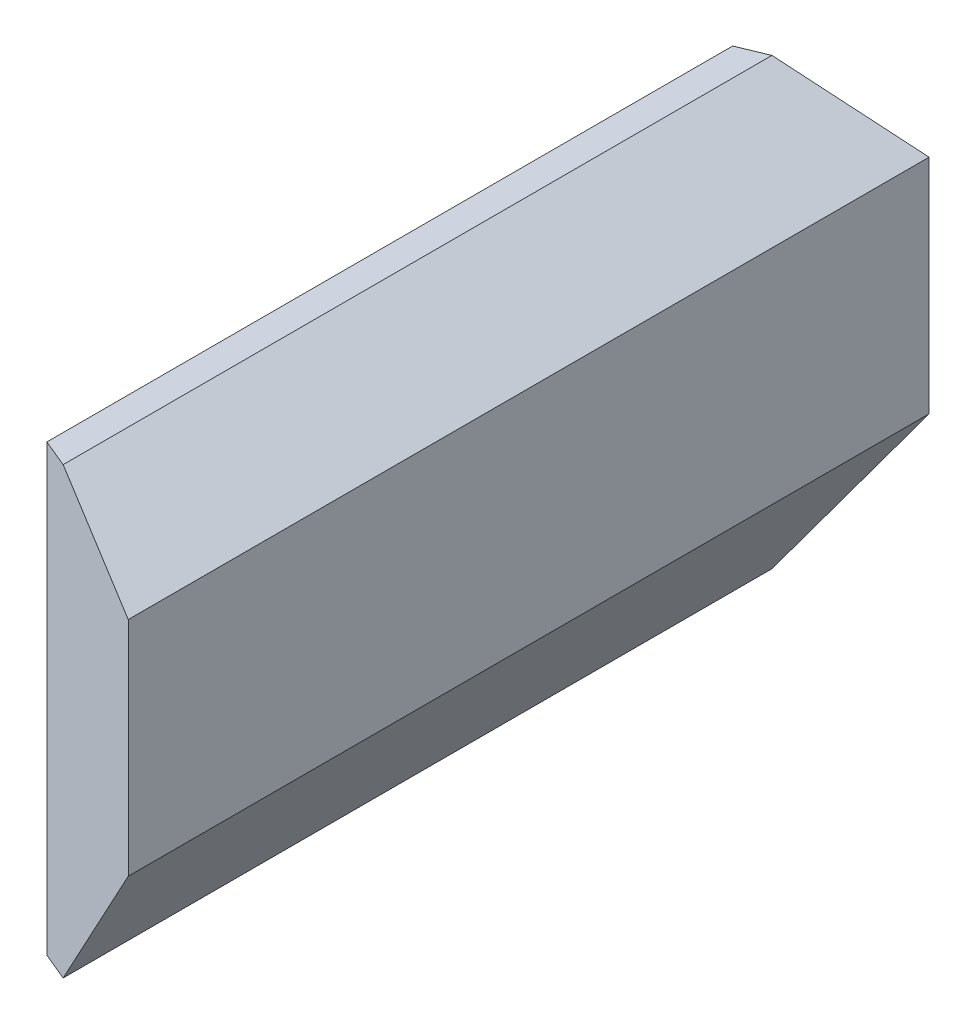
ISO-10303-21;
HEADER;
FILE_DESCRIPTION(('STEP AP214'),'2;1');
FILE_NAME('part.step','',(''),(''),'','','');
FILE_SCHEMA(('AUTOMOTIVE_DESIGN { 1 0 10303 214 1 1 1 1 }'));
ENDSEC;
DATA;
#1=APPLICATION_CONTEXT('core data for automotive mechanical design processes');
#2=APPLICATION_PROTOCOL_DEFINITION('international standard','automotive_design',2000,#1);
#3=PRODUCT_CONTEXT('',#1,'mechanical');
#4=PRODUCT('Part','Part','',(#3));
#5=PRODUCT_RELATED_PRODUCT_CATEGORY('part','',(#4));
#6=PRODUCT_DEFINITION_FORMATION('','',#4);
#7=PRODUCT_DEFINITION_CONTEXT('part definition',#1,'design');
#8=PRODUCT_DEFINITION('design','',#6,#7);
#9=PRODUCT_DEFINITION_SHAPE('','',#8);
#10=(LENGTH_UNIT() NAMED_UNIT(*) SI_UNIT(.MILLI.,.METRE.));
#11=(NAMED_UNIT(*) PLANE_ANGLE_UNIT() SI_UNIT($,.RADIAN.));
#12=(NAMED_UNIT(*) SI_UNIT($,.STERADIAN.) SOLID_ANGLE_UNIT());
#13=UNCERTAINTY_MEASURE_WITH_UNIT(LENGTH_MEASURE(1.E-05),#10,'distance_accuracy_value','');
#14=(GEOMETRIC_REPRESENTATION_CONTEXT(3) GLOBAL_UNCERTAINTY_ASSIGNED_CONTEXT((#13)) GLOBAL_UNIT_ASSIGNED_CONTEXT((#10,
#11,#12)) REPRESENTATION_CONTEXT('',''));
#15=CARTESIAN_POINT('',(0.,0.,0.));
#16=DIRECTION('',(0.,0.,1.));
#17=DIRECTION('',(1.,0.,0.));
#18=AXIS2_PLACEMENT_3D('',#15,#16,#17);
#19=CARTESIAN_POINT('',(0.,0.,150.));
#20=DIRECTION('',(1.,0.,0.));
#21=DIRECTION('',(0.,0.,-1.));
#22=AXIS2_PLACEMENT_3D('',#19,#20,#21);
#23=PLANE('',#22);
#24=DIRECTION('',(0.,0.,1.));
#25=VECTOR('',#24,1.);
#26=CARTESIAN_POINT('',(1.85048618138797E-13,-25.,78.7));
#27=LINE('',#26,#25);
#28=CARTESIAN_POINT('',(1.85048618138797E-13,-25.,78.7));
#29=VERTEX_POINT('',#28);
#30=CARTESIAN_POINT('',(0.,-25.,131.7));
#31=VERTEX_POINT('',#30);
#32=EDGE_CURVE('E59',#29,#31,#27,.T.);
#33=ORIENTED_EDGE('',*,*,#32,.F.);
#34=DIRECTION('',(0.,1.,0.));
#35=VECTOR('',#34,1.);
#36=CARTESIAN_POINT('',(1.85048618138797E-13,-25.,78.7));
#37=LINE('',#36,#35);
#38=CARTESIAN_POINT('',(-2.10885595011007E-13,45.,78.7));
#39=VERTEX_POINT('',#38);
#40=EDGE_CURVE('E214',#29,#39,#37,.T.);
#41=ORIENTED_EDGE('',*,*,#40,.T.);
#42=DIRECTION('',(0.,0.,1.));
#43=VECTOR('',#42,1.);
#44=CARTESIAN_POINT('',(-2.10885595011007E-13,45.,78.7));
#45=LINE('',#44,#43);
#46=CARTESIAN_POINT('',(-3.95934213149804E-13,45.0000000000001,131.7));
#47=VERTEX_POINT('',#46);
#48=EDGE_CURVE('E196',#39,#47,#45,.T.);
#49=ORIENTED_EDGE('',*,*,#48,.T.);
#50=DIRECTION('',(0.,1.,0.));
#51=VECTOR('',#50,1.);
#52=CARTESIAN_POINT('',(0.,-25.,131.7));
#53=LINE('',#52,#51);
#54=EDGE_CURVE('E204',#31,#47,#53,.T.);
#55=ORIENTED_EDGE('',*,*,#54,.F.);
#56=EDGE_LOOP('',(#33,#41,#49,#55));
#57=FACE_BOUND('',#56,.T.);
#58=DIRECTION('',(0.,0.,-1.));
#59=VECTOR('',#58,1.);
#60=CARTESIAN_POINT('',(0.,-30.,150.));
#61=LINE('',#60,#59);
#62=CARTESIAN_POINT('',(0.,-30.,136.7));
#63=VERTEX_POINT('',#62);
#64=CARTESIAN_POINT('',(0.,-30.,13.3));
#65=VERTEX_POINT('',#64);
#66=EDGE_CURVE('E11',#63,#65,#61,.T.);
#67=ORIENTED_EDGE('',*,*,#66,.F.);
#68=DIRECTION('',(0.,1.,0.));
#69=VECTOR('',#68,1.);
#70=CARTESIAN_POINT('',(0.,-30.001,136.7));
#71=LINE('',#70,#69);
#72=CARTESIAN_POINT('',(0.,50.,136.7));
#73=VERTEX_POINT('',#72);
#74=EDGE_CURVE('E289',#63,#73,#71,.T.);
#75=ORIENTED_EDGE('',*,*,#74,.T.);
#76=DIRECTION('',(0.,0.,-1.));
#77=VECTOR('',#76,1.);
#78=CARTESIAN_POINT('',(0.,50.,150.));
#79=LINE('',#78,#77);
#80=CARTESIAN_POINT('',(0.,50.,13.3));
#81=VERTEX_POINT('',#80);
#82=EDGE_CURVE('E323',#73,#81,#79,.T.);
#83=ORIENTED_EDGE('',*,*,#82,.T.);
#84=DIRECTION('',(0.,1.,0.));
#85=VECTOR('',#84,1.);
#86=CARTESIAN_POINT('',(0.,-30.001,13.3));
#87=LINE('',#86,#85);
#88=EDGE_CURVE('E308',#65,#81,#87,.T.);
#89=ORIENTED_EDGE('',*,*,#88,.F.);
#90=EDGE_LOOP('',(#67,#75,#83,#89));
#91=FACE_BOUND('',#90,.T.);
#92=DIRECTION('',(0.,1.,0.));
#93=VECTOR('',#92,1.);
#94=CARTESIAN_POINT('',(2.10885595011007E-13,-25.,71.3));
#95=LINE('',#94,#93);
#96=CARTESIAN_POINT('',(2.10885595011007E-13,-25.,71.3));
#97=VERTEX_POINT('',#96);
#98=CARTESIAN_POINT('',(2.10885595011007E-13,45.,71.3));
#99=VERTEX_POINT('',#98);
#100=EDGE_CURVE('E240',#97,#99,#95,.T.);
#101=ORIENTED_EDGE('',*,*,#100,.F.);
#102=DIRECTION('',(0.,0.,-1.));
#103=VECTOR('',#102,1.);
#104=CARTESIAN_POINT('',(2.10885595011007E-13,-25.,71.3));
#105=LINE('',#104,#103);
#106=CARTESIAN_POINT('',(3.95934213149804E-13,-25.,18.3));
#107=VERTEX_POINT('',#106);
#108=EDGE_CURVE('E265',#97,#107,#105,.T.);
#109=ORIENTED_EDGE('',*,*,#108,.T.);
#110=DIRECTION('',(0.,1.,0.));
#111=VECTOR('',#110,1.);
#112=CARTESIAN_POINT('',(3.95934213149804E-13,-25.,18.3));
#113=LINE('',#112,#111);
#114=CARTESIAN_POINT('',(0.,45.,18.3));
#115=VERTEX_POINT('',#114);
#116=EDGE_CURVE('E216',#107,#115,#113,.T.);
#117=ORIENTED_EDGE('',*,*,#116,.T.);
#118=DIRECTION('',(0.,0.,-1.));
#119=VECTOR('',#118,1.);
#120=CARTESIAN_POINT('',(2.10885595011007E-13,45.,71.3));
#121=LINE('',#120,#119);
#122=EDGE_CURVE('E264',#99,#115,#121,.T.);
#123=ORIENTED_EDGE('',*,*,#122,.F.);
#124=EDGE_LOOP('',(#101,#109,#117,#123));
#125=FACE_BOUND('',#124,.T.);
#126=ADVANCED_FACE('F40',(#57,#91,#125),#23,.F.);
#127=CARTESIAN_POINT('',(5.,-30.,150.));
#128=DIRECTION('',(0.,1.,0.));
#129=DIRECTION('',(0.,0.,1.));
#130=AXIS2_PLACEMENT_3D('',#127,#128,#129);
#131=PLANE('',#130);
#132=DIRECTION('',(0.,0.,-1.));
#133=VECTOR('',#132,1.);
#134=CARTESIAN_POINT('',(5.,-30.,150.));
#135=LINE('',#134,#133);
#136=CARTESIAN_POINT('',(4.99999999999999,-30.,138.771067811865));
#137=VERTEX_POINT('',#136);
#138=CARTESIAN_POINT('',(5.,-30.,11.2289321881345));
#139=VERTEX_POINT('',#138);
#140=EDGE_CURVE('E49',#137,#139,#135,.T.);
#141=ORIENTED_EDGE('',*,*,#140,.F.);
#142=DIRECTION('',(0.923879532511285,0.,0.382683432365094));
#143=VECTOR('',#142,1.);
#144=CARTESIAN_POINT('',(0.,-30.,136.7));
#145=LINE('',#144,#143);
#146=EDGE_CURVE('E299',#63,#137,#145,.T.);
#147=ORIENTED_EDGE('',*,*,#146,.F.);
#148=ORIENTED_EDGE('',*,*,#66,.T.);
#149=DIRECTION('',(-0.923879532511285,0.,0.382683432365094));
#150=VECTOR('',#149,1.);
#151=CARTESIAN_POINT('',(0.,-30.,13.3));
#152=LINE('',#151,#150);
#153=EDGE_CURVE('E320',#139,#65,#152,.T.);
#154=ORIENTED_EDGE('',*,*,#153,.F.);
#155=EDGE_LOOP('',(#141,#147,#148,#154));
#156=FACE_BOUND('',#155,.T.);
#157=ADVANCED_FACE('F42',(#156),#131,.F.);
#158=CARTESIAN_POINT('',(25.,0.,150.));
#159=DIRECTION('',(-0.832050294337844,0.554700196225229,0.));
#160=DIRECTION('',(-0.554700196225229,-0.832050294337844,0.));
#161=AXIS2_PLACEMENT_3D('',#158,#159,#160);
#162=PLANE('',#161);
#163=DIRECTION('',(0.,0.,-1.));
#164=VECTOR('',#163,1.);
#165=CARTESIAN_POINT('',(25.,0.,150.));
#166=LINE('',#165,#164);
#167=CARTESIAN_POINT('',(25.,0.,147.055339059328));
#168=VERTEX_POINT('',#167);
#169=CARTESIAN_POINT('',(25.,0.,2.94466094067248));
#170=VERTEX_POINT('',#169);
#171=EDGE_CURVE('E331',#168,#170,#166,.T.);
#172=ORIENTED_EDGE('',*,*,#171,.F.);
#173=DIRECTION('',(0.540613769225996,0.810920653838993,0.223929555219049));
#174=VECTOR('',#173,1.);
#175=CARTESIAN_POINT('',(3.28752313924208,-32.5687152911369,138.061736670889));
#176=LINE('',#175,#174);
#177=EDGE_CURVE('E296',#137,#168,#176,.T.);
#178=ORIENTED_EDGE('',*,*,#177,.F.);
#179=ORIENTED_EDGE('',*,*,#140,.T.);
#180=DIRECTION('',(-0.540613769225996,-0.810920653838993,0.223929555219049));
#181=VECTOR('',#180,1.);
#182=CARTESIAN_POINT('',(3.28752313924208,-32.5687152911369,11.9382633291105));
#183=LINE('',#182,#181);
#184=EDGE_CURVE('E316',#170,#139,#183,.T.);
#185=ORIENTED_EDGE('',*,*,#184,.F.);
#186=EDGE_LOOP('',(#172,#178,#179,#185));
#187=FACE_BOUND('',#186,.T.);
#188=ADVANCED_FACE('F339',(#187),#162,.F.);
#189=CARTESIAN_POINT('',(25.,0.,150.));
#190=DIRECTION('',(-1.,0.,0.));
#191=DIRECTION('',(0.,-1.,0.));
#192=AXIS2_PLACEMENT_3D('',#189,#190,#191);
#193=PLANE('',#192);
#194=DIRECTION('',(0.,0.,-1.));
#195=VECTOR('',#194,1.);
#196=CARTESIAN_POINT('',(25.,40.,150.));
#197=LINE('',#196,#195);
#198=CARTESIAN_POINT('',(25.,40.,147.055339059328));
#199=VERTEX_POINT('',#198);
#200=CARTESIAN_POINT('',(25.,40.,2.94466094067248));
#201=VERTEX_POINT('',#200);
#202=EDGE_CURVE('E329',#199,#201,#197,.T.);
#203=ORIENTED_EDGE('',*,*,#202,.F.);
#204=DIRECTION('',(0.,1.,0.));
#205=VECTOR('',#204,1.);
#206=CARTESIAN_POINT('',(25.,-30.001,147.055339059328));
#207=LINE('',#206,#205);
#208=EDGE_CURVE('E293',#168,#199,#207,.T.);
#209=ORIENTED_EDGE('',*,*,#208,.F.);
#210=ORIENTED_EDGE('',*,*,#171,.T.);
#211=DIRECTION('',(0.,-1.,0.));
#212=VECTOR('',#211,1.);
#213=CARTESIAN_POINT('',(25.,-30.001,2.94466094067248));
#214=LINE('',#213,#212);
#215=EDGE_CURVE('E312',#201,#170,#214,.T.);
#216=ORIENTED_EDGE('',*,*,#215,.F.);
#217=EDGE_LOOP('',(#203,#209,#210,#216));
#218=FACE_BOUND('',#217,.T.);
#219=ADVANCED_FACE('F361',(#218),#193,.F.);
#220=CARTESIAN_POINT('',(5.,50.,150.));
#221=DIRECTION('',(-0.447213595499958,-0.894427190999916,0.));
#222=DIRECTION('',(0.894427190999916,-0.447213595499958,0.));
#223=AXIS2_PLACEMENT_3D('',#220,#221,#222);
#224=PLANE('',#223);
#225=DIRECTION('',(0.,0.,-1.));
#226=VECTOR('',#225,1.);
#227=CARTESIAN_POINT('',(5.,50.,150.));
#228=LINE('',#227,#226);
#229=CARTESIAN_POINT('',(5.,50.,138.771067811865));
#230=VERTEX_POINT('',#229);
#231=CARTESIAN_POINT('',(5.,50.,11.2289321881345));
#232=VERTEX_POINT('',#231);
#233=EDGE_CURVE('E326',#230,#232,#228,.T.);
#234=ORIENTED_EDGE('',*,*,#233,.F.);
#235=DIRECTION('',(-0.838716980803309,0.419358490401655,-0.347407948441349));
#236=VECTOR('',#235,1.);
#237=CARTESIAN_POINT('',(29.0175063959594,37.9912468020203,148.719444695455));
#238=LINE('',#237,#236);
#239=EDGE_CURVE('E269',#199,#230,#238,.T.);
#240=ORIENTED_EDGE('',*,*,#239,.F.);
#241=ORIENTED_EDGE('',*,*,#202,.T.);
#242=DIRECTION('',(0.838716980803309,-0.419358490401655,-0.34740794844135));
#243=VECTOR('',#242,1.);
#244=CARTESIAN_POINT('',(29.0175063959594,37.9912468020203,1.28055530454542));
#245=LINE('',#244,#243);
#246=EDGE_CURVE('E302',#232,#201,#245,.T.);
#247=ORIENTED_EDGE('',*,*,#246,.F.);
#248=EDGE_LOOP('',(#234,#240,#241,#247));
#249=FACE_BOUND('',#248,.T.);
#250=ADVANCED_FACE('F358',(#249),#224,.F.);
#251=CARTESIAN_POINT('',(0.,50.,150.));
#252=DIRECTION('',(0.,-1.,0.));
#253=DIRECTION('',(0.,0.,-1.));
#254=AXIS2_PLACEMENT_3D('',#251,#252,#253);
#255=PLANE('',#254);
#256=ORIENTED_EDGE('',*,*,#82,.F.);
#257=DIRECTION('',(-0.923879532511285,0.,-0.382683432365094));
#258=VECTOR('',#257,1.);
#259=CARTESIAN_POINT('',(0.,50.,136.7));
#260=LINE('',#259,#258);
#261=EDGE_CURVE('E286',#230,#73,#260,.T.);
#262=ORIENTED_EDGE('',*,*,#261,.F.);
#263=ORIENTED_EDGE('',*,*,#233,.T.);
#264=DIRECTION('',(0.923879532511285,0.,-0.382683432365094));
#265=VECTOR('',#264,1.);
#266=CARTESIAN_POINT('',(0.,50.,13.3));
#267=LINE('',#266,#265);
#268=EDGE_CURVE('E305',#81,#232,#267,.T.);
#269=ORIENTED_EDGE('',*,*,#268,.F.);
#270=EDGE_LOOP('',(#256,#262,#263,#269));
#271=FACE_BOUND('',#270,.T.);
#272=ADVANCED_FACE('F353',(#271),#255,.F.);
#273=CARTESIAN_POINT('',(0.,-30.001,13.3));
#274=DIRECTION('',(0.382683432365094,0.,0.923879532511285));
#275=DIRECTION('',(0.923879532511285,0.,-0.382683432365094));
#276=AXIS2_PLACEMENT_3D('',#273,#274,#275);
#277=PLANE('',#276);
#278=ORIENTED_EDGE('',*,*,#153,.T.);
#279=ORIENTED_EDGE('',*,*,#88,.T.);
#280=ORIENTED_EDGE('',*,*,#268,.T.);
#281=ORIENTED_EDGE('',*,*,#246,.T.);
#282=ORIENTED_EDGE('',*,*,#215,.T.);
#283=ORIENTED_EDGE('',*,*,#184,.T.);
#284=EDGE_LOOP('',(#278,#279,#280,#281,#282,#283));
#285=FACE_BOUND('',#284,.T.);
#286=ADVANCED_FACE('F344',(#285),#277,.F.);
#287=CARTESIAN_POINT('',(0.,-30.001,136.7));
#288=DIRECTION('',(0.382683432365094,0.,-0.923879532511285));
#289=DIRECTION('',(-0.923879532511285,0.,-0.382683432365094));
#290=AXIS2_PLACEMENT_3D('',#287,#288,#289);
#291=PLANE('',#290);
#292=ORIENTED_EDGE('',*,*,#146,.T.);
#293=ORIENTED_EDGE('',*,*,#177,.T.);
#294=ORIENTED_EDGE('',*,*,#208,.T.);
#295=ORIENTED_EDGE('',*,*,#239,.T.);
#296=ORIENTED_EDGE('',*,*,#261,.T.);
#297=ORIENTED_EDGE('',*,*,#74,.F.);
#298=EDGE_LOOP('',(#292,#293,#294,#295,#296,#297));
#299=FACE_BOUND('',#298,.T.);
#300=ADVANCED_FACE('F364',(#299),#291,.F.);
#301=CARTESIAN_POINT('',(3.52593163271447,-25.,71.3));
#302=DIRECTION('',(0.,-1.,0.));
#303=DIRECTION('',(0.,0.,-1.));
#304=AXIS2_PLACEMENT_3D('',#301,#302,#303);
#305=PLANE('',#304);
#306=DIRECTION('',(-1.,0.,0.));
#307=VECTOR('',#306,1.);
#308=CARTESIAN_POINT('',(3.52593163271465,-25.,18.3));
#309=LINE('',#308,#307);
#310=CARTESIAN_POINT('',(3.52593163271465,-25.,18.3));
#311=VERTEX_POINT('',#310);
#312=EDGE_CURVE('E237',#311,#107,#309,.T.);
#313=ORIENTED_EDGE('',*,*,#312,.T.);
#314=ORIENTED_EDGE('',*,*,#108,.F.);
#315=DIRECTION('',(-1.,0.,0.));
#316=VECTOR('',#315,1.);
#317=CARTESIAN_POINT('',(3.52593163271447,-25.,71.3));
#318=LINE('',#317,#316);
#319=CARTESIAN_POINT('',(3.52593163271447,-25.,71.3));
#320=VERTEX_POINT('',#319);
#321=EDGE_CURVE('E260',#320,#97,#318,.T.);
#322=ORIENTED_EDGE('',*,*,#321,.F.);
#323=DIRECTION('',(0.,0.,-1.));
#324=VECTOR('',#323,1.);
#325=CARTESIAN_POINT('',(3.52593163271447,-25.,71.3));
#326=LINE('',#325,#324);
#327=EDGE_CURVE('E270',#320,#311,#326,.T.);
#328=ORIENTED_EDGE('',*,*,#327,.T.);
#329=EDGE_LOOP('',(#313,#314,#322,#328));
#330=FACE_BOUND('',#329,.T.);
#331=ADVANCED_FACE('F366',(#330),#305,.F.);
#332=CARTESIAN_POINT('',(20.9999999999998,1.21110255092798,71.3000000000001));
#333=DIRECTION('',(0.832050294337844,-0.554700196225229,0.));
#334=DIRECTION('',(0.554700196225229,0.832050294337844,0.));
#335=AXIS2_PLACEMENT_3D('',#332,#333,#334);
#336=PLANE('',#335);
#337=DIRECTION('',(-0.554700196225229,-0.832050294337844,0.));
#338=VECTOR('',#337,1.);
#339=CARTESIAN_POINT('',(20.9999999999999,1.21110255092797,18.3000000000001));
#340=LINE('',#339,#338);
#341=CARTESIAN_POINT('',(20.9999999999999,1.21110255092797,18.3000000000001));
#342=VERTEX_POINT('',#341);
#343=EDGE_CURVE('E234',#342,#311,#340,.T.);
#344=ORIENTED_EDGE('',*,*,#343,.T.);
#345=ORIENTED_EDGE('',*,*,#327,.F.);
#346=DIRECTION('',(-0.554700196225229,-0.832050294337844,0.));
#347=VECTOR('',#346,1.);
#348=CARTESIAN_POINT('',(20.9999999999998,1.21110255092798,71.3000000000001));
#349=LINE('',#348,#347);
#350=CARTESIAN_POINT('',(20.9999999999998,1.21110255092798,71.3000000000001));
#351=VERTEX_POINT('',#350);
#352=EDGE_CURVE('E256',#351,#320,#349,.T.);
#353=ORIENTED_EDGE('',*,*,#352,.F.);
#354=DIRECTION('',(0.,0.,-1.));
#355=VECTOR('',#354,1.);
#356=CARTESIAN_POINT('',(20.9999999999998,1.21110255092798,71.3000000000001));
#357=LINE('',#356,#355);
#358=EDGE_CURVE('E273',#351,#342,#357,.T.);
#359=ORIENTED_EDGE('',*,*,#358,.T.);
#360=EDGE_LOOP('',(#344,#345,#353,#359));
#361=FACE_BOUND('',#360,.T.);
#362=ADVANCED_FACE('F372',(#361),#336,.F.);
#363=CARTESIAN_POINT('',(20.9999999999998,37.5278640450004,71.3000000000001));
#364=DIRECTION('',(1.,0.,0.));
#365=DIRECTION('',(0.,0.,-1.));
#366=AXIS2_PLACEMENT_3D('',#363,#364,#365);
#367=PLANE('',#366);
#368=DIRECTION('',(0.,-1.,0.));
#369=VECTOR('',#368,1.);
#370=CARTESIAN_POINT('',(21.,37.5278640450004,18.3000000000001));
#371=LINE('',#370,#369);
#372=CARTESIAN_POINT('',(21.,37.5278640450004,18.3000000000001));
#373=VERTEX_POINT('',#372);
#374=EDGE_CURVE('E231',#373,#342,#371,.T.);
#375=ORIENTED_EDGE('',*,*,#374,.T.);
#376=ORIENTED_EDGE('',*,*,#358,.F.);
#377=DIRECTION('',(0.,-1.,0.));
#378=VECTOR('',#377,1.);
#379=CARTESIAN_POINT('',(20.9999999999998,37.5278640450004,71.3000000000001));
#380=LINE('',#379,#378);
#381=CARTESIAN_POINT('',(20.9999999999998,37.5278640450004,71.3000000000001));
#382=VERTEX_POINT('',#381);
#383=EDGE_CURVE('E252',#382,#351,#380,.T.);
#384=ORIENTED_EDGE('',*,*,#383,.F.);
#385=DIRECTION('',(0.,0.,-1.));
#386=VECTOR('',#385,1.);
#387=CARTESIAN_POINT('',(20.9999999999998,37.5278640450004,71.3000000000001));
#388=LINE('',#387,#386);
#389=EDGE_CURVE('E276',#382,#373,#388,.T.);
#390=ORIENTED_EDGE('',*,*,#389,.T.);
#391=EDGE_LOOP('',(#375,#376,#384,#390));
#392=FACE_BOUND('',#391,.T.);
#393=ADVANCED_FACE('F432',(#392),#367,.F.);
#394=CARTESIAN_POINT('',(6.05572809000063,45.,71.3));
#395=DIRECTION('',(0.447213595499959,0.894427190999915,0.));
#396=DIRECTION('',(-0.894427190999916,0.447213595499959,0.));
#397=AXIS2_PLACEMENT_3D('',#394,#395,#396);
#398=PLANE('',#397);
#399=DIRECTION('',(0.894427190999916,-0.447213595499959,0.));
#400=VECTOR('',#399,1.);
#401=CARTESIAN_POINT('',(6.05572809000082,45.,18.3));
#402=LINE('',#401,#400);
#403=CARTESIAN_POINT('',(6.05572809000082,45.,18.3));
#404=VERTEX_POINT('',#403);
#405=EDGE_CURVE('E228',#404,#373,#402,.T.);
#406=ORIENTED_EDGE('',*,*,#405,.T.);
#407=ORIENTED_EDGE('',*,*,#389,.F.);
#408=DIRECTION('',(0.894427190999916,-0.447213595499959,0.));
#409=VECTOR('',#408,1.);
#410=CARTESIAN_POINT('',(6.05572809000063,45.,71.3));
#411=LINE('',#410,#409);
#412=CARTESIAN_POINT('',(6.05572809000063,45.,71.3));
#413=VERTEX_POINT('',#412);
#414=EDGE_CURVE('E248',#413,#382,#411,.T.);
#415=ORIENTED_EDGE('',*,*,#414,.F.);
#416=DIRECTION('',(0.,0.,-1.));
#417=VECTOR('',#416,1.);
#418=CARTESIAN_POINT('',(6.05572809000063,45.,71.3));
#419=LINE('',#418,#417);
#420=EDGE_CURVE('E279',#413,#404,#419,.T.);
#421=ORIENTED_EDGE('',*,*,#420,.T.);
#422=EDGE_LOOP('',(#406,#407,#415,#421));
#423=FACE_BOUND('',#422,.T.);
#424=ADVANCED_FACE('F442',(#423),#398,.F.);
#425=CARTESIAN_POINT('',(2.10885595011007E-13,45.,71.3));
#426=DIRECTION('',(0.,1.,0.));
#427=DIRECTION('',(0.,0.,1.));
#428=AXIS2_PLACEMENT_3D('',#425,#426,#427);
#429=PLANE('',#428);
#430=DIRECTION('',(1.,0.,0.));
#431=VECTOR('',#430,1.);
#432=CARTESIAN_POINT('',(3.95934213149804E-13,45.,18.3));
#433=LINE('',#432,#431);
#434=EDGE_CURVE('E67',#115,#404,#433,.T.);
#435=ORIENTED_EDGE('',*,*,#434,.T.);
#436=ORIENTED_EDGE('',*,*,#420,.F.);
#437=DIRECTION('',(1.,0.,0.));
#438=VECTOR('',#437,1.);
#439=CARTESIAN_POINT('',(2.10885595011007E-13,45.,71.3));
#440=LINE('',#439,#438);
#441=EDGE_CURVE('E244',#99,#413,#440,.T.);
#442=ORIENTED_EDGE('',*,*,#441,.F.);
#443=ORIENTED_EDGE('',*,*,#122,.T.);
#444=EDGE_LOOP('',(#435,#436,#442,#443));
#445=FACE_BOUND('',#444,.T.);
#446=ADVANCED_FACE('F452',(#445),#429,.F.);
#447=CARTESIAN_POINT('',(2.10885595011007E-13,45.,71.3));
#448=DIRECTION('',(0.,0.,-1.));
#449=DIRECTION('',(-1.,0.,0.));
#450=AXIS2_PLACEMENT_3D('',#447,#448,#449);
#451=PLANE('',#450);
#452=ORIENTED_EDGE('',*,*,#100,.T.);
#453=ORIENTED_EDGE('',*,*,#441,.T.);
#454=ORIENTED_EDGE('',*,*,#414,.T.);
#455=ORIENTED_EDGE('',*,*,#383,.T.);
#456=ORIENTED_EDGE('',*,*,#352,.T.);
#457=ORIENTED_EDGE('',*,*,#321,.T.);
#458=EDGE_LOOP('',(#452,#453,#454,#455,#456,#457));
#459=FACE_BOUND('',#458,.T.);
#460=ADVANCED_FACE('F462',(#459),#451,.T.);
#461=CARTESIAN_POINT('',(3.95934213149804E-13,45.,18.3));
#462=DIRECTION('',(0.,0.,-1.));
#463=DIRECTION('',(-1.,0.,0.));
#464=AXIS2_PLACEMENT_3D('',#461,#462,#463);
#465=PLANE('',#464);
#466=ORIENTED_EDGE('',*,*,#116,.F.);
#467=ORIENTED_EDGE('',*,*,#312,.F.);
#468=ORIENTED_EDGE('',*,*,#343,.F.);
#469=ORIENTED_EDGE('',*,*,#374,.F.);
#470=ORIENTED_EDGE('',*,*,#405,.F.);
#471=ORIENTED_EDGE('',*,*,#434,.F.);
#472=EDGE_LOOP('',(#466,#467,#468,#469,#470,#471));
#473=FACE_BOUND('',#472,.T.);
#474=ADVANCED_FACE('F471',(#473),#465,.F.);
#475=CARTESIAN_POINT('',(-2.10885595011007E-13,45.,78.7));
#476=DIRECTION('',(0.,-1.,0.));
#477=DIRECTION('',(0.,0.,-1.));
#478=AXIS2_PLACEMENT_3D('',#475,#476,#477);
#479=PLANE('',#478);
#480=DIRECTION('',(1.,0.,0.));
#481=VECTOR('',#480,1.);
#482=CARTESIAN_POINT('',(-3.95934213149804E-13,45.0000000000001,131.7));
#483=LINE('',#482,#481);
#484=CARTESIAN_POINT('',(6.05572809000042,45.0000000000001,131.7));
#485=VERTEX_POINT('',#484);
#486=EDGE_CURVE('E192',#47,#485,#483,.T.);
#487=ORIENTED_EDGE('',*,*,#486,.F.);
#488=ORIENTED_EDGE('',*,*,#48,.F.);
#489=DIRECTION('',(1.,0.,0.));
#490=VECTOR('',#489,1.);
#491=CARTESIAN_POINT('',(-2.10885595011007E-13,45.,78.7));
#492=LINE('',#491,#490);
#493=CARTESIAN_POINT('',(6.0557280900006,45.,78.7));
#494=VERTEX_POINT('',#493);
#495=EDGE_CURVE('E554',#39,#494,#492,.T.);
#496=ORIENTED_EDGE('',*,*,#495,.T.);
#497=DIRECTION('',(0.,0.,1.));
#498=VECTOR('',#497,1.);
#499=CARTESIAN_POINT('',(6.0557280900006,45.,78.7));
#500=LINE('',#499,#498);
#501=EDGE_CURVE('E199',#494,#485,#500,.T.);
#502=ORIENTED_EDGE('',*,*,#501,.T.);
#503=EDGE_LOOP('',(#487,#488,#496,#502));
#504=FACE_BOUND('',#503,.T.);
#505=ADVANCED_FACE('F194',(#504),#479,.T.);
#506=CARTESIAN_POINT('',(6.0557280900006,45.,78.7));
#507=DIRECTION('',(-0.447213595499959,-0.894427190999915,0.));
#508=DIRECTION('',(0.894427190999915,-0.447213595499959,0.));
#509=AXIS2_PLACEMENT_3D('',#506,#507,#508);
#510=PLANE('',#509);
#511=DIRECTION('',(0.894427190999915,-0.447213595499959,0.));
#512=VECTOR('',#511,1.);
#513=CARTESIAN_POINT('',(6.05572809000042,45.0000000000001,131.7));
#514=LINE('',#513,#512);
#515=CARTESIAN_POINT('',(20.9999999999995,37.5278640450005,131.7));
#516=VERTEX_POINT('',#515);
#517=EDGE_CURVE('E203',#485,#516,#514,.T.);
#518=ORIENTED_EDGE('',*,*,#517,.F.);
#519=ORIENTED_EDGE('',*,*,#501,.F.);
#520=DIRECTION('',(0.894427190999915,-0.447213595499959,0.));
#521=VECTOR('',#520,1.);
#522=CARTESIAN_POINT('',(6.0557280900006,45.,78.7));
#523=LINE('',#522,#521);
#524=CARTESIAN_POINT('',(20.9999999999997,37.5278640450004,78.7000000000001));
#525=VERTEX_POINT('',#524);
#526=EDGE_CURVE('E576',#494,#525,#523,.T.);
#527=ORIENTED_EDGE('',*,*,#526,.T.);
#528=DIRECTION('',(0.,0.,1.));
#529=VECTOR('',#528,1.);
#530=CARTESIAN_POINT('',(20.9999999999997,37.5278640450004,78.7000000000001));
#531=LINE('',#530,#529);
#532=EDGE_CURVE('E223',#525,#516,#531,.T.);
#533=ORIENTED_EDGE('',*,*,#532,.T.);
#534=EDGE_LOOP('',(#518,#519,#527,#533));
#535=FACE_BOUND('',#534,.T.);
#536=ADVANCED_FACE('F494',(#535),#510,.T.);
#537=CARTESIAN_POINT('',(20.9999999999997,37.5278640450004,78.7000000000001));
#538=DIRECTION('',(-1.,0.,0.));
#539=DIRECTION('',(0.,0.,1.));
#540=AXIS2_PLACEMENT_3D('',#537,#538,#539);
#541=PLANE('',#540);
#542=DIRECTION('',(0.,-1.,0.));
#543=VECTOR('',#542,1.);
#544=CARTESIAN_POINT('',(20.9999999999995,37.5278640450005,131.7));
#545=LINE('',#544,#543);
#546=CARTESIAN_POINT('',(20.9999999999995,1.21110255092801,131.7));
#547=VERTEX_POINT('',#546);
#548=EDGE_CURVE('E578',#516,#547,#545,.T.);
#549=ORIENTED_EDGE('',*,*,#548,.F.);
#550=ORIENTED_EDGE('',*,*,#532,.F.);
#551=DIRECTION('',(0.,-1.,0.));
#552=VECTOR('',#551,1.);
#553=CARTESIAN_POINT('',(20.9999999999997,37.5278640450004,78.7000000000001));
#554=LINE('',#553,#552);
#555=CARTESIAN_POINT('',(20.9999999999997,1.21110255092799,78.7000000000001));
#556=VERTEX_POINT('',#555);
#557=EDGE_CURVE('E594',#525,#556,#554,.T.);
#558=ORIENTED_EDGE('',*,*,#557,.T.);
#559=DIRECTION('',(0.,0.,1.));
#560=VECTOR('',#559,1.);
#561=CARTESIAN_POINT('',(20.9999999999997,1.21110255092799,78.7000000000001));
#562=LINE('',#561,#560);
#563=EDGE_CURVE('E563',#556,#547,#562,.T.);
#564=ORIENTED_EDGE('',*,*,#563,.T.);
#565=EDGE_LOOP('',(#549,#550,#558,#564));
#566=FACE_BOUND('',#565,.T.);
#567=ADVANCED_FACE('F502',(#566),#541,.T.);
#568=CARTESIAN_POINT('',(20.9999999999997,1.21110255092799,78.7000000000001));
#569=DIRECTION('',(-0.832050294337844,0.554700196225229,0.));
#570=DIRECTION('',(-0.554700196225229,-0.832050294337844,0.));
#571=AXIS2_PLACEMENT_3D('',#568,#569,#570);
#572=PLANE('',#571);
#573=DIRECTION('',(-0.554700196225229,-0.832050294337844,0.));
#574=VECTOR('',#573,1.);
#575=CARTESIAN_POINT('',(20.9999999999995,1.21110255092801,131.7));
#576=LINE('',#575,#574);
#577=CARTESIAN_POINT('',(3.52593163271425,-25.,131.7));
#578=VERTEX_POINT('',#577);
#579=EDGE_CURVE('E582',#547,#578,#576,.T.);
#580=ORIENTED_EDGE('',*,*,#579,.F.);
#581=ORIENTED_EDGE('',*,*,#563,.F.);
#582=DIRECTION('',(-0.554700196225229,-0.832050294337844,0.));
#583=VECTOR('',#582,1.);
#584=CARTESIAN_POINT('',(20.9999999999997,1.21110255092799,78.7000000000001));
#585=LINE('',#584,#583);
#586=CARTESIAN_POINT('',(3.52593163271444,-25.,78.7000000000001));
#587=VERTEX_POINT('',#586);
#588=EDGE_CURVE('E566',#556,#587,#585,.T.);
#589=ORIENTED_EDGE('',*,*,#588,.T.);
#590=DIRECTION('',(0.,0.,1.));
#591=VECTOR('',#590,1.);
#592=CARTESIAN_POINT('',(3.52593163271444,-25.,78.7000000000001));
#593=LINE('',#592,#591);
#594=EDGE_CURVE('E558',#587,#578,#593,.T.);
#595=ORIENTED_EDGE('',*,*,#594,.T.);
#596=EDGE_LOOP('',(#580,#581,#589,#595));
#597=FACE_BOUND('',#596,.T.);
#598=ADVANCED_FACE('F511',(#597),#572,.T.);
#599=CARTESIAN_POINT('',(3.52593163271444,-25.,78.7000000000001));
#600=DIRECTION('',(0.,1.,0.));
#601=DIRECTION('',(0.,0.,1.));
#602=AXIS2_PLACEMENT_3D('',#599,#600,#601);
#603=PLANE('',#602);
#604=DIRECTION('',(-1.,0.,0.));
#605=VECTOR('',#604,1.);
#606=CARTESIAN_POINT('',(3.52593163271425,-25.,131.7));
#607=LINE('',#606,#605);
#608=EDGE_CURVE('E208',#578,#31,#607,.T.);
#609=ORIENTED_EDGE('',*,*,#608,.F.);
#610=ORIENTED_EDGE('',*,*,#594,.F.);
#611=DIRECTION('',(-1.,0.,0.));
#612=VECTOR('',#611,1.);
#613=CARTESIAN_POINT('',(3.52593163271444,-25.,78.7000000000001));
#614=LINE('',#613,#612);
#615=EDGE_CURVE('E552',#587,#29,#614,.T.);
#616=ORIENTED_EDGE('',*,*,#615,.T.);
#617=ORIENTED_EDGE('',*,*,#32,.T.);
#618=EDGE_LOOP('',(#609,#610,#616,#617));
#619=FACE_BOUND('',#618,.T.);
#620=ADVANCED_FACE('F520',(#619),#603,.T.);
#621=CARTESIAN_POINT('',(-2.10885595011007E-13,45.,78.7));
#622=DIRECTION('',(0.,0.,-1.));
#623=DIRECTION('',(-1.,0.,0.));
#624=AXIS2_PLACEMENT_3D('',#621,#622,#623);
#625=PLANE('',#624);
#626=ORIENTED_EDGE('',*,*,#40,.F.);
#627=ORIENTED_EDGE('',*,*,#615,.F.);
#628=ORIENTED_EDGE('',*,*,#588,.F.);
#629=ORIENTED_EDGE('',*,*,#557,.F.);
#630=ORIENTED_EDGE('',*,*,#526,.F.);
#631=ORIENTED_EDGE('',*,*,#495,.F.);
#632=EDGE_LOOP('',(#626,#627,#628,#629,#630,#631));
#633=FACE_BOUND('',#632,.T.);
#634=ADVANCED_FACE('F529',(#633),#625,.F.);
#635=CARTESIAN_POINT('',(-3.95934213149804E-13,45.0000000000001,131.7));
#636=DIRECTION('',(0.,0.,-1.));
#637=DIRECTION('',(-1.,0.,0.));
#638=AXIS2_PLACEMENT_3D('',#635,#636,#637);
#639=PLANE('',#638);
#640=ORIENTED_EDGE('',*,*,#54,.T.);
#641=ORIENTED_EDGE('',*,*,#486,.T.);
#642=ORIENTED_EDGE('',*,*,#517,.T.);
#643=ORIENTED_EDGE('',*,*,#548,.T.);
#644=ORIENTED_EDGE('',*,*,#579,.T.);
#645=ORIENTED_EDGE('',*,*,#608,.T.);
#646=EDGE_LOOP('',(#640,#641,#642,#643,#644,#645));
#647=FACE_BOUND('',#646,.T.);
#648=ADVANCED_FACE('F207',(#647),#639,.T.);
#649=CLOSED_SHELL('',(#126,#157,#188,#219,#250,#272,#286,#300,#331,#362,#393,#424,#446,#460,
#474,#505,#536,#567,#598,#620,#634,#648));
#650=MANIFOLD_SOLID_BREP('B2',#649);
#651=ADVANCED_BREP_SHAPE_REPRESENTATION('',(#18,#650),#14);
#652=SHAPE_DEFINITION_REPRESENTATION(#9,#651);
ENDSEC;
END-ISO-10303-21;
